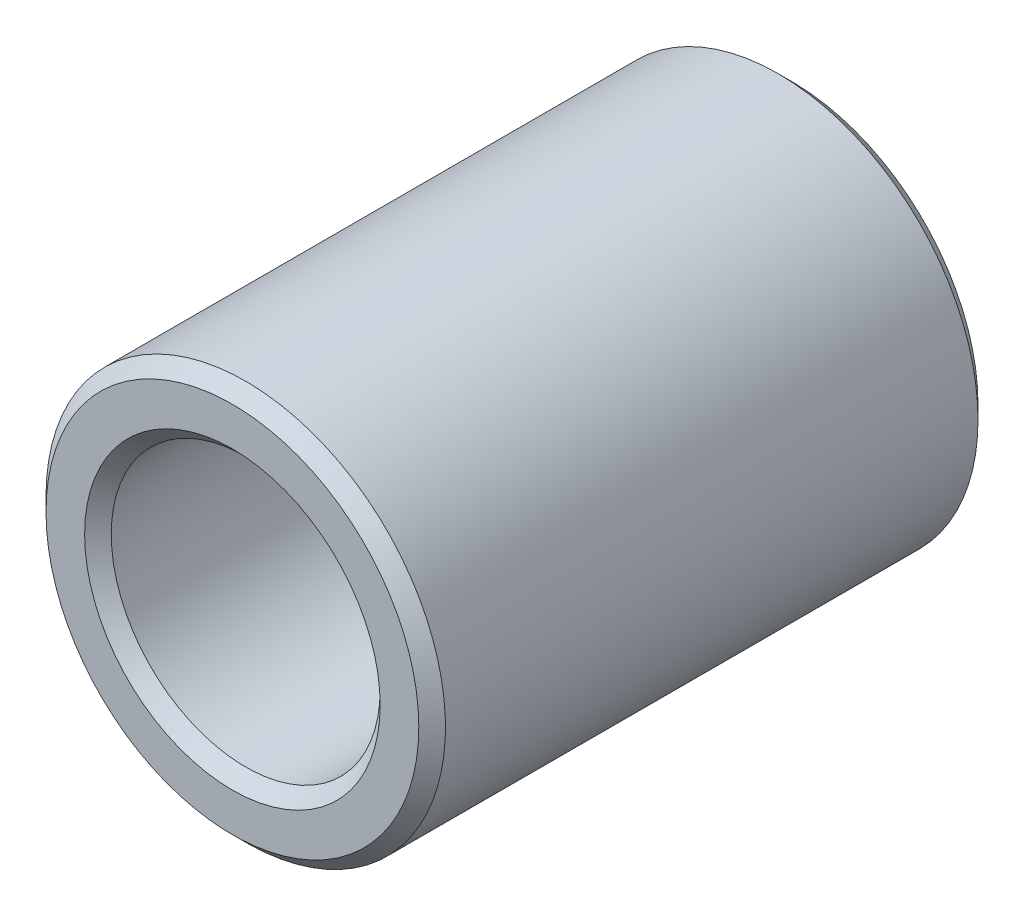
ISO-10303-21;
HEADER;
FILE_DESCRIPTION(('STEP AP214'),'2;1');
FILE_NAME('part.step','',(''),(''),'','','');
FILE_SCHEMA(('AUTOMOTIVE_DESIGN { 1 0 10303 214 1 1 1 1 }'));
ENDSEC;
DATA;
#1=APPLICATION_CONTEXT('core data for automotive mechanical design processes');
#2=APPLICATION_PROTOCOL_DEFINITION('international standard','automotive_design',2000,#1);
#3=PRODUCT_CONTEXT('',#1,'mechanical');
#4=PRODUCT('Part','Part','',(#3));
#5=PRODUCT_RELATED_PRODUCT_CATEGORY('part','',(#4));
#6=PRODUCT_DEFINITION_FORMATION('','',#4);
#7=PRODUCT_DEFINITION_CONTEXT('part definition',#1,'design');
#8=PRODUCT_DEFINITION('design','',#6,#7);
#9=PRODUCT_DEFINITION_SHAPE('','',#8);
#10=(LENGTH_UNIT() NAMED_UNIT(*) SI_UNIT(.MILLI.,.METRE.));
#11=(NAMED_UNIT(*) PLANE_ANGLE_UNIT() SI_UNIT($,.RADIAN.));
#12=(NAMED_UNIT(*) SI_UNIT($,.STERADIAN.) SOLID_ANGLE_UNIT());
#13=UNCERTAINTY_MEASURE_WITH_UNIT(LENGTH_MEASURE(1.E-05),#10,'distance_accuracy_value','');
#14=(GEOMETRIC_REPRESENTATION_CONTEXT(3) GLOBAL_UNCERTAINTY_ASSIGNED_CONTEXT((#13)) GLOBAL_UNIT_ASSIGNED_CONTEXT((#10,
#11,#12)) REPRESENTATION_CONTEXT('',''));
#15=CARTESIAN_POINT('',(0.,0.,0.));
#16=DIRECTION('',(0.,0.,1.));
#17=DIRECTION('',(1.,0.,0.));
#18=AXIS2_PLACEMENT_3D('',#15,#16,#17);
#19=CARTESIAN_POINT('',(0.,0.,10.5));
#20=DIRECTION('',(0.,0.,1.));
#21=DIRECTION('',(1.,0.,0.));
#22=AXIS2_PLACEMENT_3D('',#19,#20,#21);
#23=PLANE('',#22);
#24=CARTESIAN_POINT('',(0.,0.,10.5));
#25=DIRECTION('',(0.,0.,1.));
#26=DIRECTION('',(1.,0.,0.));
#27=AXIS2_PLACEMENT_3D('',#24,#25,#26);
#28=CIRCLE('',#27,5.55000000000002);
#29=CARTESIAN_POINT('',(5.55000000000002,0.,10.5));
#30=VERTEX_POINT('',#29);
#31=EDGE_CURVE('E12',#30,#30,#28,.F.);
#32=ORIENTED_EDGE('',*,*,#31,.T.);
#33=EDGE_LOOP('',(#32));
#34=FACE_BOUND('',#33,.T.);
#35=CARTESIAN_POINT('',(0.,0.,10.5));
#36=DIRECTION('',(0.,0.,1.));
#37=DIRECTION('',(1.,0.,0.));
#38=AXIS2_PLACEMENT_3D('',#35,#36,#37);
#39=CIRCLE('',#38,7.00000000000001);
#40=CARTESIAN_POINT('',(7.00000000000001,0.,10.5));
#41=VERTEX_POINT('',#40);
#42=EDGE_CURVE('E66',#41,#41,#39,.T.);
#43=ORIENTED_EDGE('',*,*,#42,.T.);
#44=EDGE_LOOP('',(#43));
#45=FACE_BOUND('',#44,.T.);
#46=ADVANCED_FACE('F63',(#34,#45),#23,.T.);
#47=CARTESIAN_POINT('',(0.,0.,-10.5));
#48=DIRECTION('',(0.,0.,1.));
#49=DIRECTION('',(1.,0.,0.));
#50=AXIS2_PLACEMENT_3D('',#47,#48,#49);
#51=PLANE('',#50);
#52=CARTESIAN_POINT('',(0.,0.,-10.5));
#53=DIRECTION('',(0.,0.,1.));
#54=DIRECTION('',(1.,0.,0.));
#55=AXIS2_PLACEMENT_3D('',#52,#53,#54);
#56=CIRCLE('',#55,5.54999999999999);
#57=CARTESIAN_POINT('',(5.54999999999999,0.,-10.5));
#58=VERTEX_POINT('',#57);
#59=EDGE_CURVE('E96',#58,#58,#56,.T.);
#60=ORIENTED_EDGE('',*,*,#59,.T.);
#61=EDGE_LOOP('',(#60));
#62=FACE_BOUND('',#61,.T.);
#63=CARTESIAN_POINT('',(0.,0.,-10.5));
#64=DIRECTION('',(0.,0.,1.));
#65=DIRECTION('',(1.,0.,0.));
#66=AXIS2_PLACEMENT_3D('',#63,#64,#65);
#67=CIRCLE('',#66,6.99999999999998);
#68=CARTESIAN_POINT('',(6.99999999999998,0.,-10.5));
#69=VERTEX_POINT('',#68);
#70=EDGE_CURVE('E99',#69,#69,#67,.F.);
#71=ORIENTED_EDGE('',*,*,#70,.T.);
#72=EDGE_LOOP('',(#71));
#73=FACE_BOUND('',#72,.T.);
#74=ADVANCED_FACE('F106',(#62,#73),#51,.F.);
#75=CARTESIAN_POINT('',(0.,0.,10.5));
#76=DIRECTION('',(0.,0.,-1.));
#77=DIRECTION('',(-1.,0.,0.));
#78=AXIS2_PLACEMENT_3D('',#75,#76,#77);
#79=CYLINDRICAL_SURFACE('',#78,7.5);
#80=CARTESIAN_POINT('',(0.,0.,-9.99999999999998));
#81=DIRECTION('',(0.,0.,1.));
#82=DIRECTION('',(1.,0.,0.));
#83=AXIS2_PLACEMENT_3D('',#80,#81,#82);
#84=CIRCLE('',#83,7.5);
#85=CARTESIAN_POINT('',(-7.5,0.,-9.99999999999999));
#86=VERTEX_POINT('',#85);
#87=EDGE_CURVE('E78',#86,#86,#84,.T.);
#88=CARTESIAN_POINT('',(0.,0.,10.));
#89=DIRECTION('',(0.,0.,1.));
#90=DIRECTION('',(1.,0.,0.));
#91=AXIS2_PLACEMENT_3D('',#88,#89,#90);
#92=CIRCLE('',#91,7.5);
#93=CARTESIAN_POINT('',(-7.5,0.,10.));
#94=VERTEX_POINT('',#93);
#95=EDGE_CURVE('E84',#94,#94,#92,.F.);
#96=CARTESIAN_POINT('',(-7.5,0.,-9.99999999999999));
#97=CARTESIAN_POINT('',(-7.5,0.,-9.79166666666665));
#98=CARTESIAN_POINT('',(-7.5,0.,-9.58333333333332));
#99=CARTESIAN_POINT('',(-7.5,0.,-9.16666666666665));
#100=CARTESIAN_POINT('',(-7.5,0.,-8.95833333333332));
#101=CARTESIAN_POINT('',(-7.5,0.,-8.54166666666665));
#102=CARTESIAN_POINT('',(-7.5,0.,-8.33333333333332));
#103=CARTESIAN_POINT('',(-7.5,0.,-7.91666666666666));
#104=CARTESIAN_POINT('',(-7.5,0.,-7.70833333333332));
#105=CARTESIAN_POINT('',(-7.5,0.,-7.29166666666665));
#106=CARTESIAN_POINT('',(-7.5,0.,-7.08333333333332));
#107=CARTESIAN_POINT('',(-7.5,0.,-6.66666666666665));
#108=CARTESIAN_POINT('',(-7.5,0.,-6.45833333333332));
#109=CARTESIAN_POINT('',(-7.5,0.,-6.04166666666665));
#110=CARTESIAN_POINT('',(-7.5,0.,-5.83333333333332));
#111=CARTESIAN_POINT('',(-7.5,0.,-5.41666666666665));
#112=CARTESIAN_POINT('',(-7.5,0.,-5.20833333333332));
#113=CARTESIAN_POINT('',(-7.5,0.,-4.79166666666666));
#114=CARTESIAN_POINT('',(-7.5,0.,-4.58333333333332));
#115=CARTESIAN_POINT('',(-7.5,0.,-4.16666666666666));
#116=CARTESIAN_POINT('',(-7.5,0.,-3.95833333333332));
#117=CARTESIAN_POINT('',(-7.5,0.,-3.54166666666666));
#118=CARTESIAN_POINT('',(-7.5,0.,-3.33333333333332));
#119=CARTESIAN_POINT('',(-7.5,0.,-2.91666666666666));
#120=CARTESIAN_POINT('',(-7.5,0.,-2.70833333333332));
#121=CARTESIAN_POINT('',(-7.5,0.,-2.29166666666666));
#122=CARTESIAN_POINT('',(-7.5,0.,-2.08333333333332));
#123=CARTESIAN_POINT('',(-7.5,0.,-1.66666666666666));
#124=CARTESIAN_POINT('',(-7.5,0.,-1.45833333333332));
#125=CARTESIAN_POINT('',(-7.5,0.,-1.04166666666666));
#126=CARTESIAN_POINT('',(-7.5,0.,-0.833333333333323));
#127=CARTESIAN_POINT('',(-7.5,0.,-0.416666666666657));
#128=CARTESIAN_POINT('',(-7.5,0.,-0.208333333333323));
#129=CARTESIAN_POINT('',(-7.5,0.,0.208333333333344));
#130=CARTESIAN_POINT('',(-7.5,0.,0.416666666666677));
#131=CARTESIAN_POINT('',(-7.5,0.,0.833333333333344));
#132=CARTESIAN_POINT('',(-7.5,0.,1.04166666666668));
#133=CARTESIAN_POINT('',(-7.5,0.,1.45833333333334));
#134=CARTESIAN_POINT('',(-7.5,0.,1.66666666666668));
#135=CARTESIAN_POINT('',(-7.5,0.,2.08333333333334));
#136=CARTESIAN_POINT('',(-7.5,0.,2.29166666666668));
#137=CARTESIAN_POINT('',(-7.5,0.,2.70833333333334));
#138=CARTESIAN_POINT('',(-7.5,0.,2.91666666666668));
#139=CARTESIAN_POINT('',(-7.5,0.,3.33333333333334));
#140=CARTESIAN_POINT('',(-7.5,0.,3.54166666666668));
#141=CARTESIAN_POINT('',(-7.5,0.,3.95833333333334));
#142=CARTESIAN_POINT('',(-7.5,0.,4.16666666666667));
#143=CARTESIAN_POINT('',(-7.5,0.,4.58333333333334));
#144=CARTESIAN_POINT('',(-7.5,0.,4.79166666666667));
#145=CARTESIAN_POINT('',(-7.5,0.,5.20833333333334));
#146=CARTESIAN_POINT('',(-7.5,0.,5.41666666666668));
#147=CARTESIAN_POINT('',(-7.5,0.,5.83333333333334));
#148=CARTESIAN_POINT('',(-7.5,0.,6.04166666666667));
#149=CARTESIAN_POINT('',(-7.5,0.,6.45833333333334));
#150=CARTESIAN_POINT('',(-7.5,0.,6.66666666666667));
#151=CARTESIAN_POINT('',(-7.5,0.,7.08333333333334));
#152=CARTESIAN_POINT('',(-7.5,0.,7.29166666666667));
#153=CARTESIAN_POINT('',(-7.5,0.,7.70833333333334));
#154=CARTESIAN_POINT('',(-7.5,0.,7.91666666666668));
#155=CARTESIAN_POINT('',(-7.5,0.,8.33333333333334));
#156=CARTESIAN_POINT('',(-7.5,0.,8.54166666666667));
#157=CARTESIAN_POINT('',(-7.5,0.,8.95833333333334));
#158=CARTESIAN_POINT('',(-7.5,0.,9.16666666666667));
#159=CARTESIAN_POINT('',(-7.5,0.,9.58333333333334));
#160=CARTESIAN_POINT('',(-7.5,0.,9.79166666666667));
#161=CARTESIAN_POINT('',(-7.5,0.,10.));
#162=B_SPLINE_CURVE_WITH_KNOTS('',3,(#96,#97,#98,#99,#100,#101,#102,#103,#104,#105,#106,#107,
#108,#109,#110,#111,#112,#113,#114,#115,#116,#117,#118,#119,#120,#121,#122,#123,#124,#125,#126,
#127,#128,#129,#130,#131,#132,#133,#134,#135,#136,#137,#138,#139,#140,#141,#142,#143,#144,#145,
#146,#147,#148,#149,#150,#151,#152,#153,#154,#155,#156,#157,#158,#159,#160,#161),.UNSPECIFIED.,
.F.,.F.,(4,2,2,2,2,2,2,2,2,2,2,2,2,2,2,2,2,2,2,2,2,2,2,2,2,2,2,2,2,2,2,2,4),(0.,
0.625000000000001,1.25,1.875,2.5,3.125,3.75,4.375,5.,5.625,6.25,6.875,7.5,8.125,8.75,9.375,10.,
10.625,11.25,11.875,12.5,13.125,13.75,14.375,15.,15.625,16.25,16.875,17.5,18.125,18.75,19.375,
20.),.UNSPECIFIED.);
#163=EDGE_CURVE('BSEAM118',#86,#94,#162,.T.);
#164=ORIENTED_EDGE('',*,*,#87,.T.);
#165=ORIENTED_EDGE('',*,*,#95,.T.);
#166=ORIENTED_EDGE('',*,*,#163,.T.);
#167=ORIENTED_EDGE('',*,*,#163,.F.);
#168=EDGE_LOOP('',(#164,#166,#165,#167));
#169=FACE_BOUND('',#168,.T.);
#170=ADVANCED_FACE('F118',(#169),#79,.T.);
#171=CARTESIAN_POINT('',(0.,0.,10.5));
#172=DIRECTION('',(0.,0.,-1.));
#173=DIRECTION('',(-1.,0.,0.));
#174=AXIS2_PLACEMENT_3D('',#171,#172,#173);
#175=CYLINDRICAL_SURFACE('',#174,5.05);
#176=CARTESIAN_POINT('',(0.,0.,-10.));
#177=DIRECTION('',(0.,0.,1.));
#178=DIRECTION('',(1.,0.,0.));
#179=AXIS2_PLACEMENT_3D('',#176,#177,#178);
#180=CIRCLE('',#179,5.05);
#181=CARTESIAN_POINT('',(-5.05,0.,-10.));
#182=VERTEX_POINT('',#181);
#183=EDGE_CURVE('E86',#182,#182,#180,.F.);
#184=CARTESIAN_POINT('',(0.,0.,9.99999999999999));
#185=DIRECTION('',(0.,0.,1.));
#186=DIRECTION('',(1.,0.,0.));
#187=AXIS2_PLACEMENT_3D('',#184,#185,#186);
#188=CIRCLE('',#187,5.05);
#189=CARTESIAN_POINT('',(-5.05,0.,9.99999999999999));
#190=VERTEX_POINT('',#189);
#191=EDGE_CURVE('E95',#190,#190,#188,.T.);
#192=CARTESIAN_POINT('',(-5.05,0.,-10.));
#193=CARTESIAN_POINT('',(-5.05,0.,-9.79166666666667));
#194=CARTESIAN_POINT('',(-5.05,0.,-9.58333333333334));
#195=CARTESIAN_POINT('',(-5.05,0.,-9.16666666666667));
#196=CARTESIAN_POINT('',(-5.05,0.,-8.95833333333334));
#197=CARTESIAN_POINT('',(-5.05,0.,-8.54166666666667));
#198=CARTESIAN_POINT('',(-5.05,0.,-8.33333333333334));
#199=CARTESIAN_POINT('',(-5.05,0.,-7.91666666666668));
#200=CARTESIAN_POINT('',(-5.05,0.,-7.70833333333334));
#201=CARTESIAN_POINT('',(-5.05,0.,-7.29166666666667));
#202=CARTESIAN_POINT('',(-5.05,0.,-7.08333333333334));
#203=CARTESIAN_POINT('',(-5.05,0.,-6.66666666666667));
#204=CARTESIAN_POINT('',(-5.05,0.,-6.45833333333334));
#205=CARTESIAN_POINT('',(-5.05,0.,-6.04166666666667));
#206=CARTESIAN_POINT('',(-5.05,0.,-5.83333333333334));
#207=CARTESIAN_POINT('',(-5.05,0.,-5.41666666666667));
#208=CARTESIAN_POINT('',(-5.05,0.,-5.20833333333334));
#209=CARTESIAN_POINT('',(-5.05,0.,-4.79166666666668));
#210=CARTESIAN_POINT('',(-5.05,0.,-4.58333333333334));
#211=CARTESIAN_POINT('',(-5.05,0.,-4.16666666666668));
#212=CARTESIAN_POINT('',(-5.05,0.,-3.95833333333334));
#213=CARTESIAN_POINT('',(-5.05,0.,-3.54166666666668));
#214=CARTESIAN_POINT('',(-5.05,0.,-3.33333333333334));
#215=CARTESIAN_POINT('',(-5.05,0.,-2.91666666666668));
#216=CARTESIAN_POINT('',(-5.05,0.,-2.70833333333334));
#217=CARTESIAN_POINT('',(-5.05,0.,-2.29166666666668));
#218=CARTESIAN_POINT('',(-5.05,0.,-2.08333333333334));
#219=CARTESIAN_POINT('',(-5.05,0.,-1.66666666666668));
#220=CARTESIAN_POINT('',(-5.05,0.,-1.45833333333334));
#221=CARTESIAN_POINT('',(-5.05,0.,-1.04166666666668));
#222=CARTESIAN_POINT('',(-5.05,0.,-0.833333333333344));
#223=CARTESIAN_POINT('',(-5.05,0.,-0.416666666666677));
#224=CARTESIAN_POINT('',(-5.05,0.,-0.208333333333344));
#225=CARTESIAN_POINT('',(-5.05,0.,0.208333333333323));
#226=CARTESIAN_POINT('',(-5.05,0.,0.416666666666657));
#227=CARTESIAN_POINT('',(-5.05,0.,0.833333333333323));
#228=CARTESIAN_POINT('',(-5.05,0.,1.04166666666666));
#229=CARTESIAN_POINT('',(-5.05,0.,1.45833333333332));
#230=CARTESIAN_POINT('',(-5.05,0.,1.66666666666666));
#231=CARTESIAN_POINT('',(-5.05,0.,2.08333333333332));
#232=CARTESIAN_POINT('',(-5.05,0.,2.29166666666666));
#233=CARTESIAN_POINT('',(-5.05,0.,2.70833333333332));
#234=CARTESIAN_POINT('',(-5.05,0.,2.91666666666665));
#235=CARTESIAN_POINT('',(-5.05,0.,3.33333333333332));
#236=CARTESIAN_POINT('',(-5.05,0.,3.54166666666666));
#237=CARTESIAN_POINT('',(-5.05,0.,3.95833333333332));
#238=CARTESIAN_POINT('',(-5.05,0.,4.16666666666665));
#239=CARTESIAN_POINT('',(-5.05,0.,4.58333333333332));
#240=CARTESIAN_POINT('',(-5.05,0.,4.79166666666665));
#241=CARTESIAN_POINT('',(-5.05,0.,5.20833333333332));
#242=CARTESIAN_POINT('',(-5.05,0.,5.41666666666665));
#243=CARTESIAN_POINT('',(-5.05,0.,5.83333333333332));
#244=CARTESIAN_POINT('',(-5.05,0.,6.04166666666665));
#245=CARTESIAN_POINT('',(-5.05,0.,6.45833333333332));
#246=CARTESIAN_POINT('',(-5.05,0.,6.66666666666665));
#247=CARTESIAN_POINT('',(-5.05,0.,7.08333333333332));
#248=CARTESIAN_POINT('',(-5.05,0.,7.29166666666665));
#249=CARTESIAN_POINT('',(-5.05,0.,7.70833333333332));
#250=CARTESIAN_POINT('',(-5.05,0.,7.91666666666666));
#251=CARTESIAN_POINT('',(-5.05,0.,8.33333333333332));
#252=CARTESIAN_POINT('',(-5.05,0.,8.54166666666665));
#253=CARTESIAN_POINT('',(-5.05,0.,8.95833333333332));
#254=CARTESIAN_POINT('',(-5.05,0.,9.16666666666665));
#255=CARTESIAN_POINT('',(-5.05,0.,9.58333333333332));
#256=CARTESIAN_POINT('',(-5.05,0.,9.79166666666665));
#257=CARTESIAN_POINT('',(-5.05,0.,9.99999999999999));
#258=B_SPLINE_CURVE_WITH_KNOTS('',3,(#192,#193,#194,#195,#196,#197,#198,#199,#200,#201,#202,
#203,#204,#205,#206,#207,#208,#209,#210,#211,#212,#213,#214,#215,#216,#217,#218,#219,#220,#221,
#222,#223,#224,#225,#226,#227,#228,#229,#230,#231,#232,#233,#234,#235,#236,#237,#238,#239,#240,
#241,#242,#243,#244,#245,#246,#247,#248,#249,#250,#251,#252,#253,#254,#255,#256,#257),
.UNSPECIFIED.,.F.,.F.,(4,2,2,2,2,2,2,2,2,2,2,2,2,2,2,2,2,2,2,2,2,2,2,2,2,2,2,2,2,2,2,2,4),(0.,
0.625000000000001,1.25,1.875,2.5,3.125,3.75,4.375,5.,5.625,6.25,6.875,7.5,8.125,8.75,9.375,10.,
10.625,11.25,11.875,12.5,13.125,13.75,14.375,15.,15.625,16.25,16.875,17.5,18.125,18.75,19.375,
20.),.UNSPECIFIED.);
#259=EDGE_CURVE('BSEAM120',#182,#190,#258,.T.);
#260=ORIENTED_EDGE('',*,*,#183,.T.);
#261=ORIENTED_EDGE('',*,*,#191,.T.);
#262=ORIENTED_EDGE('',*,*,#259,.T.);
#263=ORIENTED_EDGE('',*,*,#259,.F.);
#264=EDGE_LOOP('',(#260,#262,#261,#263));
#265=FACE_BOUND('',#264,.T.);
#266=ADVANCED_FACE('F120',(#265),#175,.F.);
#267=CARTESIAN_POINT('',(0.,0.,-10.5));
#268=DIRECTION('',(0.,0.,-1.));
#269=DIRECTION('',(-1.,0.,0.));
#270=AXIS2_PLACEMENT_3D('',#267,#268,#269);
#271=CONICAL_SURFACE('',#270,5.54999999999999,0.785398163397443);
#272=ORIENTED_EDGE('',*,*,#183,.F.);
#273=EDGE_LOOP('',(#272));
#274=FACE_BOUND('',#273,.T.);
#275=ORIENTED_EDGE('',*,*,#59,.F.);
#276=EDGE_LOOP('',(#275));
#277=FACE_BOUND('',#276,.T.);
#278=ADVANCED_FACE('F115',(#274,#277),#271,.F.);
#279=CARTESIAN_POINT('',(0.,0.,-9.99999999999998));
#280=DIRECTION('',(0.,0.,1.));
#281=DIRECTION('',(1.,0.,0.));
#282=AXIS2_PLACEMENT_3D('',#279,#280,#281);
#283=CONICAL_SURFACE('',#282,7.5,0.785398163397447);
#284=ORIENTED_EDGE('',*,*,#70,.F.);
#285=EDGE_LOOP('',(#284));
#286=FACE_BOUND('',#285,.T.);
#287=ORIENTED_EDGE('',*,*,#87,.F.);
#288=EDGE_LOOP('',(#287));
#289=FACE_BOUND('',#288,.T.);
#290=ADVANCED_FACE('F107',(#286,#289),#283,.T.);
#291=CARTESIAN_POINT('',(0.,0.,9.99999999999999));
#292=DIRECTION('',(0.,0.,1.));
#293=DIRECTION('',(1.,0.,0.));
#294=AXIS2_PLACEMENT_3D('',#291,#292,#293);
#295=CONICAL_SURFACE('',#294,5.05,0.785398163397452);
#296=ORIENTED_EDGE('',*,*,#31,.F.);
#297=EDGE_LOOP('',(#296));
#298=FACE_BOUND('',#297,.T.);
#299=ORIENTED_EDGE('',*,*,#191,.F.);
#300=EDGE_LOOP('',(#299));
#301=FACE_BOUND('',#300,.T.);
#302=ADVANCED_FACE('F112',(#298,#301),#295,.F.);
#303=CARTESIAN_POINT('',(0.,0.,10.5));
#304=DIRECTION('',(0.,0.,-1.));
#305=DIRECTION('',(-1.,0.,0.));
#306=AXIS2_PLACEMENT_3D('',#303,#304,#305);
#307=CONICAL_SURFACE('',#306,7.00000000000001,0.785398163397445);
#308=ORIENTED_EDGE('',*,*,#95,.F.);
#309=EDGE_LOOP('',(#308));
#310=FACE_BOUND('',#309,.T.);
#311=ORIENTED_EDGE('',*,*,#42,.F.);
#312=EDGE_LOOP('',(#311));
#313=FACE_BOUND('',#312,.T.);
#314=ADVANCED_FACE('F65',(#310,#313),#307,.T.);
#315=CLOSED_SHELL('',(#46,#74,#170,#266,#278,#290,#302,#314));
#316=MANIFOLD_SOLID_BREP('B2',#315);
#317=ADVANCED_BREP_SHAPE_REPRESENTATION('',(#18,#316),#14);
#318=SHAPE_DEFINITION_REPRESENTATION(#9,#317);
ENDSEC;
END-ISO-10303-21;
